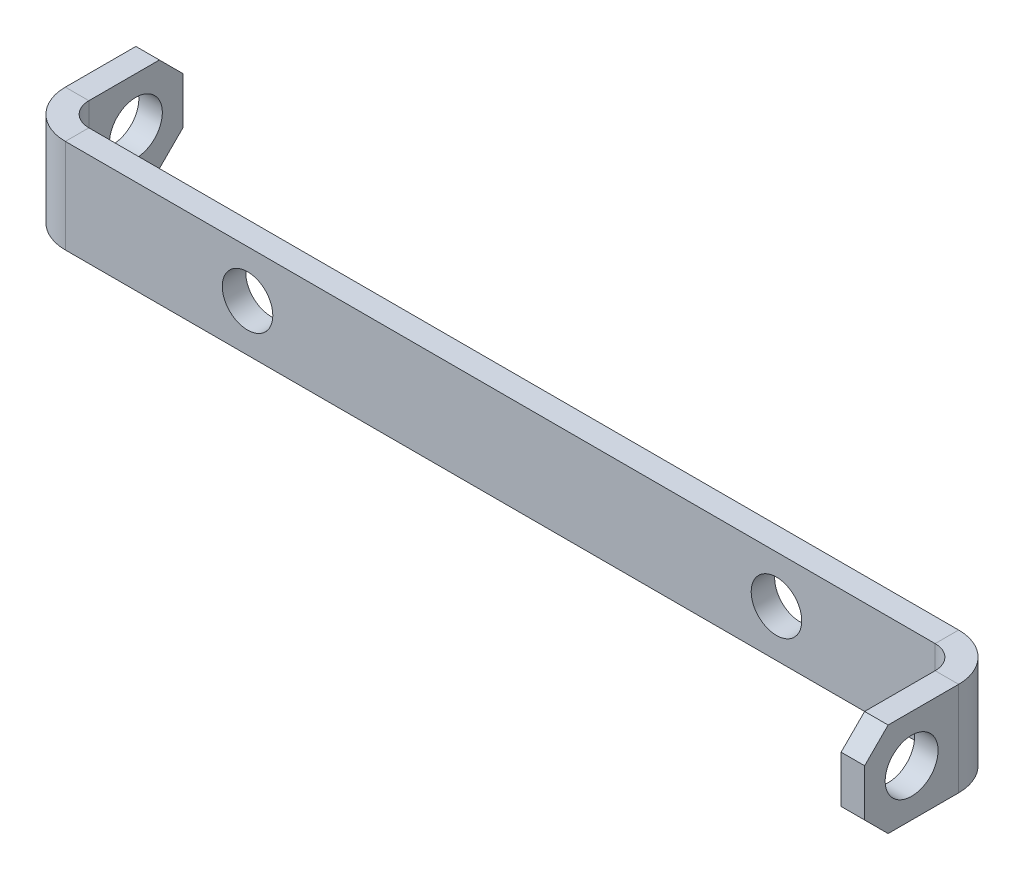
ISO-10303-21;
HEADER;
FILE_DESCRIPTION(('STEP AP214'),'2;1');
FILE_NAME('part.step','',(''),(''),'','','');
FILE_SCHEMA(('AUTOMOTIVE_DESIGN { 1 0 10303 214 1 1 1 1 }'));
ENDSEC;
DATA;
#1=APPLICATION_CONTEXT('core data for automotive mechanical design processes');
#2=APPLICATION_PROTOCOL_DEFINITION('international standard','automotive_design',2000,#1);
#3=PRODUCT_CONTEXT('',#1,'mechanical');
#4=PRODUCT('Part','Part','',(#3));
#5=PRODUCT_RELATED_PRODUCT_CATEGORY('part','',(#4));
#6=PRODUCT_DEFINITION_FORMATION('','',#4);
#7=PRODUCT_DEFINITION_CONTEXT('part definition',#1,'design');
#8=PRODUCT_DEFINITION('design','',#6,#7);
#9=PRODUCT_DEFINITION_SHAPE('','',#8);
#10=(LENGTH_UNIT() NAMED_UNIT(*) SI_UNIT(.MILLI.,.METRE.));
#11=(NAMED_UNIT(*) PLANE_ANGLE_UNIT() SI_UNIT($,.RADIAN.));
#12=(NAMED_UNIT(*) SI_UNIT($,.STERADIAN.) SOLID_ANGLE_UNIT());
#13=UNCERTAINTY_MEASURE_WITH_UNIT(LENGTH_MEASURE(1.E-05),#10,'distance_accuracy_value','');
#14=(GEOMETRIC_REPRESENTATION_CONTEXT(3) GLOBAL_UNCERTAINTY_ASSIGNED_CONTEXT((#13)) GLOBAL_UNIT_ASSIGNED_CONTEXT((#10,
#11,#12)) REPRESENTATION_CONTEXT('',''));
#15=CARTESIAN_POINT('',(0.,0.,0.));
#16=DIRECTION('',(0.,0.,1.));
#17=DIRECTION('',(1.,0.,0.));
#18=AXIS2_PLACEMENT_3D('',#15,#16,#17);
#19=CARTESIAN_POINT('',(-38.,8.,0.));
#20=DIRECTION('',(0.,1.,0.));
#21=DIRECTION('',(0.,0.,1.));
#22=AXIS2_PLACEMENT_3D('',#19,#20,#21);
#23=PLANE('',#22);
#24=DIRECTION('',(0.,0.,1.));
#25=VECTOR('',#24,1.);
#26=CARTESIAN_POINT('',(-38.,8.,0.));
#27=LINE('',#26,#25);
#28=CARTESIAN_POINT('',(-38.,8.,0.));
#29=VERTEX_POINT('',#28);
#30=CARTESIAN_POINT('',(-38.,8.,2.));
#31=VERTEX_POINT('',#30);
#32=EDGE_CURVE('E169',#29,#31,#27,.T.);
#33=ORIENTED_EDGE('',*,*,#32,.F.);
#34=CARTESIAN_POINT('',(-38.,8.,-2.));
#35=DIRECTION('',(0.,-1.,0.));
#36=DIRECTION('',(0.,0.,-1.));
#37=AXIS2_PLACEMENT_3D('',#34,#35,#36);
#38=CIRCLE('',#37,2.);
#39=CARTESIAN_POINT('',(-40.,8.,-2.));
#40=VERTEX_POINT('',#39);
#41=EDGE_CURVE('E167',#29,#40,#38,.T.);
#42=ORIENTED_EDGE('',*,*,#41,.T.);
#43=DIRECTION('',(1.,0.,0.));
#44=VECTOR('',#43,1.);
#45=CARTESIAN_POINT('',(-42.,8.,-2.));
#46=LINE('',#45,#44);
#47=CARTESIAN_POINT('',(-42.,8.,-2.));
#48=VERTEX_POINT('',#47);
#49=EDGE_CURVE('E161',#48,#40,#46,.T.);
#50=ORIENTED_EDGE('',*,*,#49,.F.);
#51=CARTESIAN_POINT('',(-38.,8.,-2.));
#52=DIRECTION('',(0.,1.,0.));
#53=DIRECTION('',(1.,0.,0.));
#54=AXIS2_PLACEMENT_3D('',#51,#52,#53);
#55=CIRCLE('',#54,4.);
#56=EDGE_CURVE('E164',#31,#48,#55,.F.);
#57=ORIENTED_EDGE('',*,*,#56,.F.);
#58=EDGE_LOOP('',(#33,#42,#50,#57));
#59=FACE_BOUND('',#58,.T.);
#60=ADVANCED_FACE('F44',(#59),#23,.T.);
#61=CARTESIAN_POINT('',(-42.,8.,-2.));
#62=DIRECTION('',(0.,1.,0.));
#63=DIRECTION('',(0.,0.,1.));
#64=AXIS2_PLACEMENT_3D('',#61,#62,#63);
#65=PLANE('',#64);
#66=DIRECTION('',(-1.,0.,0.));
#67=VECTOR('',#66,1.);
#68=CARTESIAN_POINT('',(-40.,8.,0.));
#69=LINE('',#68,#67);
#70=CARTESIAN_POINT('',(36.,8.,0.));
#71=VERTEX_POINT('',#70);
#72=EDGE_CURVE('E205',#71,#29,#69,.T.);
#73=ORIENTED_EDGE('',*,*,#72,.T.);
#74=ORIENTED_EDGE('',*,*,#32,.T.);
#75=DIRECTION('',(-1.,0.,0.));
#76=VECTOR('',#75,1.);
#77=CARTESIAN_POINT('',(-40.,8.,2.));
#78=LINE('',#77,#76);
#79=CARTESIAN_POINT('',(36.,8.,1.99999999999999));
#80=VERTEX_POINT('',#79);
#81=EDGE_CURVE('E190',#80,#31,#78,.T.);
#82=ORIENTED_EDGE('',*,*,#81,.F.);
#83=DIRECTION('',(0.,0.,-1.));
#84=VECTOR('',#83,1.);
#85=CARTESIAN_POINT('',(36.,8.,1.99999999999999));
#86=LINE('',#85,#84);
#87=EDGE_CURVE('E269',#80,#71,#86,.T.);
#88=ORIENTED_EDGE('',*,*,#87,.T.);
#89=EDGE_LOOP('',(#73,#74,#82,#88));
#90=FACE_BOUND('',#89,.T.);
#91=ADVANCED_FACE('F417',(#90),#65,.T.);
#92=CARTESIAN_POINT('',(-40.,0.,-2.));
#93=DIRECTION('',(0.,-1.,0.));
#94=DIRECTION('',(0.,0.,-1.));
#95=AXIS2_PLACEMENT_3D('',#92,#93,#94);
#96=PLANE('',#95);
#97=DIRECTION('',(-1.,0.,0.));
#98=VECTOR('',#97,1.);
#99=CARTESIAN_POINT('',(-40.,0.,-2.));
#100=LINE('',#99,#98);
#101=CARTESIAN_POINT('',(-40.,0.,-2.));
#102=VERTEX_POINT('',#101);
#103=CARTESIAN_POINT('',(-42.,0.,-2.));
#104=VERTEX_POINT('',#103);
#105=EDGE_CURVE('E170',#102,#104,#100,.T.);
#106=ORIENTED_EDGE('',*,*,#105,.F.);
#107=CARTESIAN_POINT('',(-38.,0.,-2.));
#108=DIRECTION('',(0.,-1.,0.));
#109=DIRECTION('',(0.,0.,-1.));
#110=AXIS2_PLACEMENT_3D('',#107,#108,#109);
#111=CIRCLE('',#110,2.);
#112=CARTESIAN_POINT('',(-38.,0.,0.));
#113=VERTEX_POINT('',#112);
#114=EDGE_CURVE('E233',#113,#102,#111,.T.);
#115=ORIENTED_EDGE('',*,*,#114,.F.);
#116=DIRECTION('',(0.,0.,-1.));
#117=VECTOR('',#116,1.);
#118=CARTESIAN_POINT('',(-38.,0.,2.));
#119=LINE('',#118,#117);
#120=CARTESIAN_POINT('',(-38.,0.,2.));
#121=VERTEX_POINT('',#120);
#122=EDGE_CURVE('E274',#121,#113,#119,.T.);
#123=ORIENTED_EDGE('',*,*,#122,.F.);
#124=CARTESIAN_POINT('',(-38.,0.,-2.));
#125=DIRECTION('',(0.,1.,0.));
#126=DIRECTION('',(1.,0.,0.));
#127=AXIS2_PLACEMENT_3D('',#124,#125,#126);
#128=CIRCLE('',#127,4.);
#129=EDGE_CURVE('E215',#121,#104,#128,.F.);
#130=ORIENTED_EDGE('',*,*,#129,.T.);
#131=EDGE_LOOP('',(#106,#115,#123,#130));
#132=FACE_BOUND('',#131,.T.);
#133=ADVANCED_FACE('F395',(#132),#96,.T.);
#134=CARTESIAN_POINT('',(-38.,0.,2.));
#135=DIRECTION('',(0.,-1.,0.));
#136=DIRECTION('',(0.,0.,-1.));
#137=AXIS2_PLACEMENT_3D('',#134,#135,#136);
#138=PLANE('',#137);
#139=DIRECTION('',(0.,0.,-1.));
#140=VECTOR('',#139,1.);
#141=CARTESIAN_POINT('',(-42.,0.,-10.));
#142=LINE('',#141,#140);
#143=CARTESIAN_POINT('',(-42.,0.,-8.00000000000001));
#144=VERTEX_POINT('',#143);
#145=EDGE_CURVE('E177',#104,#144,#142,.T.);
#146=ORIENTED_EDGE('',*,*,#145,.T.);
#147=DIRECTION('',(1.,0.,0.));
#148=VECTOR('',#147,1.);
#149=CARTESIAN_POINT('',(-38.,0.,-8.00000000000001));
#150=LINE('',#149,#148);
#151=CARTESIAN_POINT('',(-40.,0.,-8.00000000000001));
#152=VERTEX_POINT('',#151);
#153=EDGE_CURVE('E11',#144,#152,#150,.T.);
#154=ORIENTED_EDGE('',*,*,#153,.T.);
#155=DIRECTION('',(0.,0.,-1.));
#156=VECTOR('',#155,1.);
#157=CARTESIAN_POINT('',(-40.,0.,-10.));
#158=LINE('',#157,#156);
#159=EDGE_CURVE('E210',#102,#152,#158,.T.);
#160=ORIENTED_EDGE('',*,*,#159,.F.);
#161=ORIENTED_EDGE('',*,*,#105,.T.);
#162=EDGE_LOOP('',(#146,#154,#160,#161));
#163=FACE_BOUND('',#162,.T.);
#164=ADVANCED_FACE('F405',(#163),#138,.T.);
#165=CARTESIAN_POINT('',(40.,8.,3.99999999999999));
#166=DIRECTION('',(0.,1.,0.));
#167=DIRECTION('',(0.,0.,1.));
#168=AXIS2_PLACEMENT_3D('',#165,#166,#167);
#169=PLANE('',#168);
#170=DIRECTION('',(-1.,0.,0.));
#171=VECTOR('',#170,1.);
#172=CARTESIAN_POINT('',(40.,8.,3.99999999999999));
#173=LINE('',#172,#171);
#174=CARTESIAN_POINT('',(40.,8.,3.99999999999999));
#175=VERTEX_POINT('',#174);
#176=CARTESIAN_POINT('',(38.,8.,3.99999999999999));
#177=VERTEX_POINT('',#176);
#178=EDGE_CURVE('E271',#175,#177,#173,.T.);
#179=ORIENTED_EDGE('',*,*,#178,.F.);
#180=CARTESIAN_POINT('',(36.,8.,3.99999999999999));
#181=DIRECTION('',(0.,1.,0.));
#182=DIRECTION('',(0.,0.,1.));
#183=AXIS2_PLACEMENT_3D('',#180,#181,#182);
#184=CIRCLE('',#183,4.);
#185=EDGE_CURVE('E202',#175,#71,#184,.T.);
#186=ORIENTED_EDGE('',*,*,#185,.T.);
#187=ORIENTED_EDGE('',*,*,#87,.F.);
#188=CARTESIAN_POINT('',(36.,8.,3.99999999999999));
#189=DIRECTION('',(0.,1.,0.));
#190=DIRECTION('',(1.,0.,0.));
#191=AXIS2_PLACEMENT_3D('',#188,#189,#190);
#192=CIRCLE('',#191,2.);
#193=EDGE_CURVE('E192',#177,#80,#192,.T.);
#194=ORIENTED_EDGE('',*,*,#193,.F.);
#195=EDGE_LOOP('',(#179,#186,#187,#194));
#196=FACE_BOUND('',#195,.T.);
#197=ADVANCED_FACE('F567',(#196),#169,.T.);
#198=CARTESIAN_POINT('',(36.,8.,1.99999999999999));
#199=DIRECTION('',(0.,1.,0.));
#200=DIRECTION('',(0.,0.,1.));
#201=AXIS2_PLACEMENT_3D('',#198,#199,#200);
#202=PLANE('',#201);
#203=DIRECTION('',(0.,0.,-1.));
#204=VECTOR('',#203,1.);
#205=CARTESIAN_POINT('',(38.,8.,12.));
#206=LINE('',#205,#204);
#207=CARTESIAN_POINT('',(38.,8.,9.99999999999999));
#208=VERTEX_POINT('',#207);
#209=EDGE_CURVE('E198',#208,#177,#206,.T.);
#210=ORIENTED_EDGE('',*,*,#209,.F.);
#211=DIRECTION('',(1.,0.,0.));
#212=VECTOR('',#211,1.);
#213=CARTESIAN_POINT('',(36.,8.,9.99999999999999));
#214=LINE('',#213,#212);
#215=CARTESIAN_POINT('',(40.,8.,9.99999999999999));
#216=VERTEX_POINT('',#215);
#217=EDGE_CURVE('E294',#208,#216,#214,.T.);
#218=ORIENTED_EDGE('',*,*,#217,.T.);
#219=DIRECTION('',(0.,0.,-1.));
#220=VECTOR('',#219,1.);
#221=CARTESIAN_POINT('',(40.,8.,12.));
#222=LINE('',#221,#220);
#223=EDGE_CURVE('E200',#216,#175,#222,.T.);
#224=ORIENTED_EDGE('',*,*,#223,.T.);
#225=ORIENTED_EDGE('',*,*,#178,.T.);
#226=EDGE_LOOP('',(#210,#218,#224,#225));
#227=FACE_BOUND('',#226,.T.);
#228=ADVANCED_FACE('F572',(#227),#202,.T.);
#229=CARTESIAN_POINT('',(36.,0.,0.));
#230=DIRECTION('',(0.,-1.,0.));
#231=DIRECTION('',(0.,0.,-1.));
#232=AXIS2_PLACEMENT_3D('',#229,#230,#231);
#233=PLANE('',#232);
#234=DIRECTION('',(0.,0.,1.));
#235=VECTOR('',#234,1.);
#236=CARTESIAN_POINT('',(36.,0.,0.));
#237=LINE('',#236,#235);
#238=CARTESIAN_POINT('',(36.,0.,0.));
#239=VERTEX_POINT('',#238);
#240=CARTESIAN_POINT('',(36.,0.,1.99999999999999));
#241=VERTEX_POINT('',#240);
#242=EDGE_CURVE('E267',#239,#241,#237,.T.);
#243=ORIENTED_EDGE('',*,*,#242,.F.);
#244=CARTESIAN_POINT('',(36.,0.,3.99999999999999));
#245=DIRECTION('',(0.,1.,0.));
#246=DIRECTION('',(0.,0.,1.));
#247=AXIS2_PLACEMENT_3D('',#244,#245,#246);
#248=CIRCLE('',#247,4.);
#249=CARTESIAN_POINT('',(40.,0.,3.99999999999999));
#250=VERTEX_POINT('',#249);
#251=EDGE_CURVE('E227',#250,#239,#248,.T.);
#252=ORIENTED_EDGE('',*,*,#251,.F.);
#253=DIRECTION('',(1.,0.,0.));
#254=VECTOR('',#253,1.);
#255=CARTESIAN_POINT('',(38.,0.,3.99999999999999));
#256=LINE('',#255,#254);
#257=CARTESIAN_POINT('',(38.,0.,3.99999999999999));
#258=VERTEX_POINT('',#257);
#259=EDGE_CURVE('E264',#258,#250,#256,.T.);
#260=ORIENTED_EDGE('',*,*,#259,.F.);
#261=CARTESIAN_POINT('',(36.,0.,3.99999999999999));
#262=DIRECTION('',(0.,1.,0.));
#263=DIRECTION('',(1.,0.,0.));
#264=AXIS2_PLACEMENT_3D('',#261,#262,#263);
#265=CIRCLE('',#264,2.);
#266=EDGE_CURVE('E220',#258,#241,#265,.T.);
#267=ORIENTED_EDGE('',*,*,#266,.T.);
#268=EDGE_LOOP('',(#243,#252,#260,#267));
#269=FACE_BOUND('',#268,.T.);
#270=ADVANCED_FACE('F380',(#269),#233,.T.);
#271=CARTESIAN_POINT('',(38.,0.,3.99999999999999));
#272=DIRECTION('',(0.,-1.,0.));
#273=DIRECTION('',(0.,0.,-1.));
#274=AXIS2_PLACEMENT_3D('',#271,#272,#273);
#275=PLANE('',#274);
#276=DIRECTION('',(-1.,0.,0.));
#277=VECTOR('',#276,1.);
#278=CARTESIAN_POINT('',(-40.,0.,0.));
#279=LINE('',#278,#277);
#280=EDGE_CURVE('E230',#239,#113,#279,.T.);
#281=ORIENTED_EDGE('',*,*,#280,.F.);
#282=ORIENTED_EDGE('',*,*,#242,.T.);
#283=DIRECTION('',(-1.,0.,0.));
#284=VECTOR('',#283,1.);
#285=CARTESIAN_POINT('',(-40.,0.,2.));
#286=LINE('',#285,#284);
#287=EDGE_CURVE('E217',#241,#121,#286,.T.);
#288=ORIENTED_EDGE('',*,*,#287,.T.);
#289=ORIENTED_EDGE('',*,*,#122,.T.);
#290=EDGE_LOOP('',(#281,#282,#288,#289));
#291=FACE_BOUND('',#290,.T.);
#292=ADVANCED_FACE('F384',(#291),#275,.T.);
#293=CARTESIAN_POINT('',(-40.,8.,-10.));
#294=DIRECTION('',(-1.,0.,0.));
#295=DIRECTION('',(0.,0.,1.));
#296=AXIS2_PLACEMENT_3D('',#293,#294,#295);
#297=PLANE('',#296);
#298=CARTESIAN_POINT('',(-40.,4.,-6.));
#299=DIRECTION('',(-1.,0.,0.));
#300=DIRECTION('',(0.,0.,1.));
#301=AXIS2_PLACEMENT_3D('',#298,#299,#300);
#302=CIRCLE('',#301,2.25);
#303=CARTESIAN_POINT('',(-40.,4.,-3.75));
#304=VERTEX_POINT('',#303);
#305=EDGE_CURVE('E329',#304,#304,#302,.T.);
#306=ORIENTED_EDGE('',*,*,#305,.T.);
#307=EDGE_LOOP('',(#306));
#308=FACE_BOUND('',#307,.T.);
#309=DIRECTION('',(0.,-1.,0.));
#310=VECTOR('',#309,1.);
#311=CARTESIAN_POINT('',(-40.,8.,-10.));
#312=LINE('',#311,#310);
#313=CARTESIAN_POINT('',(-40.,6.00000000000001,-10.));
#314=VERTEX_POINT('',#313);
#315=CARTESIAN_POINT('',(-40.,2.,-10.));
#316=VERTEX_POINT('',#315);
#317=EDGE_CURVE('E261',#314,#316,#312,.T.);
#318=ORIENTED_EDGE('',*,*,#317,.F.);
#319=DIRECTION('',(0.,-0.707106781186546,-0.707106781186549));
#320=VECTOR('',#319,1.);
#321=CARTESIAN_POINT('',(-40.,6.00000000000001,-10.));
#322=LINE('',#321,#320);
#323=CARTESIAN_POINT('',(-40.,8.,-8.));
#324=VERTEX_POINT('',#323);
#325=EDGE_CURVE('E310',#314,#324,#322,.F.);
#326=ORIENTED_EDGE('',*,*,#325,.T.);
#327=DIRECTION('',(0.,0.,-1.));
#328=VECTOR('',#327,1.);
#329=CARTESIAN_POINT('',(-40.,8.,-10.));
#330=LINE('',#329,#328);
#331=EDGE_CURVE('E185',#40,#324,#330,.T.);
#332=ORIENTED_EDGE('',*,*,#331,.F.);
#333=DIRECTION('',(0.,-1.,0.));
#334=VECTOR('',#333,1.);
#335=CARTESIAN_POINT('',(-40.,8.,-2.));
#336=LINE('',#335,#334);
#337=EDGE_CURVE('E209',#40,#102,#336,.T.);
#338=ORIENTED_EDGE('',*,*,#337,.T.);
#339=ORIENTED_EDGE('',*,*,#159,.T.);
#340=DIRECTION('',(0.,-0.707106781186549,0.707106781186546));
#341=VECTOR('',#340,1.);
#342=CARTESIAN_POINT('',(-40.,0.,-8.00000000000001));
#343=LINE('',#342,#341);
#344=EDGE_CURVE('E308',#152,#316,#343,.F.);
#345=ORIENTED_EDGE('',*,*,#344,.T.);
#346=EDGE_LOOP('',(#318,#326,#332,#338,#339,#345));
#347=FACE_BOUND('',#346,.T.);
#348=ADVANCED_FACE('F323',(#308,#347),#297,.F.);
#349=CARTESIAN_POINT('',(-42.,8.,-10.));
#350=DIRECTION('',(0.,0.,-1.));
#351=DIRECTION('',(-1.,0.,0.));
#352=AXIS2_PLACEMENT_3D('',#349,#350,#351);
#353=PLANE('',#352);
#354=DIRECTION('',(0.,-1.,0.));
#355=VECTOR('',#354,1.);
#356=CARTESIAN_POINT('',(-42.,8.,-10.));
#357=LINE('',#356,#355);
#358=CARTESIAN_POINT('',(-42.,6.00000000000001,-10.));
#359=VERTEX_POINT('',#358);
#360=CARTESIAN_POINT('',(-42.,2.,-10.));
#361=VERTEX_POINT('',#360);
#362=EDGE_CURVE('E181',#359,#361,#357,.T.);
#363=ORIENTED_EDGE('',*,*,#362,.F.);
#364=DIRECTION('',(1.,0.,0.));
#365=VECTOR('',#364,1.);
#366=CARTESIAN_POINT('',(-42.,6.00000000000001,-10.));
#367=LINE('',#366,#365);
#368=EDGE_CURVE('E305',#359,#314,#367,.T.);
#369=ORIENTED_EDGE('',*,*,#368,.T.);
#370=ORIENTED_EDGE('',*,*,#317,.T.);
#371=DIRECTION('',(-1.,0.,0.));
#372=VECTOR('',#371,1.);
#373=CARTESIAN_POINT('',(-42.,2.,-10.));
#374=LINE('',#373,#372);
#375=EDGE_CURVE('E303',#316,#361,#374,.T.);
#376=ORIENTED_EDGE('',*,*,#375,.T.);
#377=EDGE_LOOP('',(#363,#369,#370,#376));
#378=FACE_BOUND('',#377,.T.);
#379=ADVANCED_FACE('F317',(#378),#353,.T.);
#380=CARTESIAN_POINT('',(-42.,8.,-10.));
#381=DIRECTION('',(-1.,0.,0.));
#382=DIRECTION('',(0.,0.,1.));
#383=AXIS2_PLACEMENT_3D('',#380,#381,#382);
#384=PLANE('',#383);
#385=CARTESIAN_POINT('',(-42.,4.,-6.));
#386=DIRECTION('',(-1.,0.,0.));
#387=DIRECTION('',(0.,0.,1.));
#388=AXIS2_PLACEMENT_3D('',#385,#386,#387);
#389=CIRCLE('',#388,2.25);
#390=CARTESIAN_POINT('',(-42.,4.,-3.75));
#391=VERTEX_POINT('',#390);
#392=EDGE_CURVE('E332',#391,#391,#389,.T.);
#393=ORIENTED_EDGE('',*,*,#392,.F.);
#394=EDGE_LOOP('',(#393));
#395=FACE_BOUND('',#394,.T.);
#396=DIRECTION('',(0.,0.,-1.));
#397=VECTOR('',#396,1.);
#398=CARTESIAN_POINT('',(-42.,8.,-10.));
#399=LINE('',#398,#397);
#400=CARTESIAN_POINT('',(-42.,8.,-8.));
#401=VERTEX_POINT('',#400);
#402=EDGE_CURVE('E175',#48,#401,#399,.T.);
#403=ORIENTED_EDGE('',*,*,#402,.T.);
#404=DIRECTION('',(0.,0.707106781186546,0.707106781186549));
#405=VECTOR('',#404,1.);
#406=CARTESIAN_POINT('',(-42.,7.,-9.));
#407=LINE('',#406,#405);
#408=EDGE_CURVE('E52',#401,#359,#407,.F.);
#409=ORIENTED_EDGE('',*,*,#408,.T.);
#410=ORIENTED_EDGE('',*,*,#362,.T.);
#411=DIRECTION('',(0.,0.707106781186549,-0.707106781186546));
#412=VECTOR('',#411,1.);
#413=CARTESIAN_POINT('',(-42.,5.00000000000001,-13.));
#414=LINE('',#413,#412);
#415=EDGE_CURVE('E59',#361,#144,#414,.F.);
#416=ORIENTED_EDGE('',*,*,#415,.T.);
#417=ORIENTED_EDGE('',*,*,#145,.F.);
#418=DIRECTION('',(0.,-1.,0.));
#419=VECTOR('',#418,1.);
#420=CARTESIAN_POINT('',(-42.,8.,-2.));
#421=LINE('',#420,#419);
#422=EDGE_CURVE('E173',#48,#104,#421,.T.);
#423=ORIENTED_EDGE('',*,*,#422,.F.);
#424=EDGE_LOOP('',(#403,#409,#410,#416,#417,#423));
#425=FACE_BOUND('',#424,.T.);
#426=ADVANCED_FACE('F174',(#395,#425),#384,.T.);
#427=CARTESIAN_POINT('',(-38.,8.,-2.));
#428=DIRECTION('',(0.,-1.,0.));
#429=DIRECTION('',(0.,0.,-1.));
#430=AXIS2_PLACEMENT_3D('',#427,#428,#429);
#431=CYLINDRICAL_SURFACE('',#430,4.);
#432=ORIENTED_EDGE('',*,*,#129,.F.);
#433=DIRECTION('',(0.,-1.,0.));
#434=VECTOR('',#433,1.);
#435=CARTESIAN_POINT('',(-38.,8.,2.));
#436=LINE('',#435,#434);
#437=EDGE_CURVE('E182',#31,#121,#436,.T.);
#438=ORIENTED_EDGE('',*,*,#437,.F.);
#439=ORIENTED_EDGE('',*,*,#56,.T.);
#440=ORIENTED_EDGE('',*,*,#422,.T.);
#441=EDGE_LOOP('',(#432,#438,#439,#440));
#442=FACE_BOUND('',#441,.T.);
#443=ADVANCED_FACE('F188',(#442),#431,.T.);
#444=CARTESIAN_POINT('',(-40.,8.,2.));
#445=DIRECTION('',(0.,0.,1.));
#446=DIRECTION('',(1.,0.,0.));
#447=AXIS2_PLACEMENT_3D('',#444,#445,#446);
#448=PLANE('',#447);
#449=CARTESIAN_POINT('',(22.5,4.00000000000001,2.));
#450=DIRECTION('',(0.,0.,1.));
#451=DIRECTION('',(-1.,0.,0.));
#452=AXIS2_PLACEMENT_3D('',#449,#450,#451);
#453=CIRCLE('',#452,2.15);
#454=CARTESIAN_POINT('',(20.35,4.00000000000001,2.));
#455=VERTEX_POINT('',#454);
#456=EDGE_CURVE('E285',#455,#455,#453,.T.);
#457=ORIENTED_EDGE('',*,*,#456,.F.);
#458=EDGE_LOOP('',(#457));
#459=FACE_BOUND('',#458,.T.);
#460=CARTESIAN_POINT('',(-22.5,4.,2.));
#461=DIRECTION('',(0.,0.,1.));
#462=DIRECTION('',(1.,0.,0.));
#463=AXIS2_PLACEMENT_3D('',#460,#461,#462);
#464=CIRCLE('',#463,2.15);
#465=CARTESIAN_POINT('',(-20.35,4.,2.));
#466=VERTEX_POINT('',#465);
#467=EDGE_CURVE('E281',#466,#466,#464,.T.);
#468=ORIENTED_EDGE('',*,*,#467,.F.);
#469=EDGE_LOOP('',(#468));
#470=FACE_BOUND('',#469,.T.);
#471=ORIENTED_EDGE('',*,*,#287,.F.);
#472=DIRECTION('',(0.,-1.,0.));
#473=VECTOR('',#472,1.);
#474=CARTESIAN_POINT('',(36.,8.,1.99999999999999));
#475=LINE('',#474,#473);
#476=EDGE_CURVE('E256',#80,#241,#475,.T.);
#477=ORIENTED_EDGE('',*,*,#476,.F.);
#478=ORIENTED_EDGE('',*,*,#81,.T.);
#479=ORIENTED_EDGE('',*,*,#437,.T.);
#480=EDGE_LOOP('',(#471,#477,#478,#479));
#481=FACE_BOUND('',#480,.T.);
#482=ADVANCED_FACE('F393',(#459,#470,#481),#448,.T.);
#483=CARTESIAN_POINT('',(36.,8.,3.99999999999999));
#484=DIRECTION('',(0.,-1.,0.));
#485=DIRECTION('',(0.,0.,-1.));
#486=AXIS2_PLACEMENT_3D('',#483,#484,#485);
#487=CYLINDRICAL_SURFACE('',#486,2.);
#488=ORIENTED_EDGE('',*,*,#266,.F.);
#489=DIRECTION('',(0.,-1.,0.));
#490=VECTOR('',#489,1.);
#491=CARTESIAN_POINT('',(38.,8.,3.99999999999999));
#492=LINE('',#491,#490);
#493=EDGE_CURVE('E253',#177,#258,#492,.T.);
#494=ORIENTED_EDGE('',*,*,#493,.F.);
#495=ORIENTED_EDGE('',*,*,#193,.T.);
#496=ORIENTED_EDGE('',*,*,#476,.T.);
#497=EDGE_LOOP('',(#488,#494,#495,#496));
#498=FACE_BOUND('',#497,.T.);
#499=ADVANCED_FACE('F388',(#498),#487,.F.);
#500=CARTESIAN_POINT('',(38.,8.,12.));
#501=DIRECTION('',(-1.,0.,0.));
#502=DIRECTION('',(0.,0.,1.));
#503=AXIS2_PLACEMENT_3D('',#500,#501,#502);
#504=PLANE('',#503);
#505=CARTESIAN_POINT('',(38.,4.,7.99999999999999));
#506=DIRECTION('',(-1.,0.,0.));
#507=DIRECTION('',(0.,0.,1.));
#508=AXIS2_PLACEMENT_3D('',#505,#506,#507);
#509=CIRCLE('',#508,2.25);
#510=CARTESIAN_POINT('',(38.,4.,10.25));
#511=VERTEX_POINT('',#510);
#512=EDGE_CURVE('E335',#511,#511,#509,.T.);
#513=ORIENTED_EDGE('',*,*,#512,.F.);
#514=EDGE_LOOP('',(#513));
#515=FACE_BOUND('',#514,.T.);
#516=DIRECTION('',(0.,-1.,0.));
#517=VECTOR('',#516,1.);
#518=CARTESIAN_POINT('',(38.,8.,12.));
#519=LINE('',#518,#517);
#520=CARTESIAN_POINT('',(38.,6.00000000000001,12.));
#521=VERTEX_POINT('',#520);
#522=CARTESIAN_POINT('',(38.,2.,12.));
#523=VERTEX_POINT('',#522);
#524=EDGE_CURVE('E250',#521,#523,#519,.T.);
#525=ORIENTED_EDGE('',*,*,#524,.F.);
#526=DIRECTION('',(0.,-0.707106781186546,0.707106781186549));
#527=VECTOR('',#526,1.);
#528=CARTESIAN_POINT('',(38.,7.,11.));
#529=LINE('',#528,#527);
#530=EDGE_CURVE('E292',#521,#208,#529,.F.);
#531=ORIENTED_EDGE('',*,*,#530,.T.);
#532=ORIENTED_EDGE('',*,*,#209,.T.);
#533=ORIENTED_EDGE('',*,*,#493,.T.);
#534=DIRECTION('',(0.,0.,-1.));
#535=VECTOR('',#534,1.);
#536=CARTESIAN_POINT('',(38.,0.,12.));
#537=LINE('',#536,#535);
#538=CARTESIAN_POINT('',(38.,0.,9.99999999999999));
#539=VERTEX_POINT('',#538);
#540=EDGE_CURVE('E223',#539,#258,#537,.T.);
#541=ORIENTED_EDGE('',*,*,#540,.F.);
#542=DIRECTION('',(0.,0.707106781186549,0.707106781186546));
#543=VECTOR('',#542,1.);
#544=CARTESIAN_POINT('',(38.,5.00000000000001,15.));
#545=LINE('',#544,#543);
#546=EDGE_CURVE('E290',#539,#523,#545,.T.);
#547=ORIENTED_EDGE('',*,*,#546,.T.);
#548=EDGE_LOOP('',(#525,#531,#532,#533,#541,#547));
#549=FACE_BOUND('',#548,.T.);
#550=ADVANCED_FACE('F365',(#515,#549),#504,.T.);
#551=CARTESIAN_POINT('',(40.,8.,12.));
#552=DIRECTION('',(0.,0.,1.));
#553=DIRECTION('',(1.,0.,0.));
#554=AXIS2_PLACEMENT_3D('',#551,#552,#553);
#555=PLANE('',#554);
#556=DIRECTION('',(0.,-1.,0.));
#557=VECTOR('',#556,1.);
#558=CARTESIAN_POINT('',(40.,8.,12.));
#559=LINE('',#558,#557);
#560=CARTESIAN_POINT('',(40.,6.00000000000001,12.));
#561=VERTEX_POINT('',#560);
#562=CARTESIAN_POINT('',(40.,2.,12.));
#563=VERTEX_POINT('',#562);
#564=EDGE_CURVE('E247',#561,#563,#559,.T.);
#565=ORIENTED_EDGE('',*,*,#564,.F.);
#566=DIRECTION('',(-1.,0.,0.));
#567=VECTOR('',#566,1.);
#568=CARTESIAN_POINT('',(40.,6.00000000000001,12.));
#569=LINE('',#568,#567);
#570=EDGE_CURVE('E287',#561,#521,#569,.T.);
#571=ORIENTED_EDGE('',*,*,#570,.T.);
#572=ORIENTED_EDGE('',*,*,#524,.T.);
#573=DIRECTION('',(1.,0.,0.));
#574=VECTOR('',#573,1.);
#575=CARTESIAN_POINT('',(40.,2.,12.));
#576=LINE('',#575,#574);
#577=EDGE_CURVE('E278',#523,#563,#576,.T.);
#578=ORIENTED_EDGE('',*,*,#577,.T.);
#579=EDGE_LOOP('',(#565,#571,#572,#578));
#580=FACE_BOUND('',#579,.T.);
#581=ADVANCED_FACE('F348',(#580),#555,.T.);
#582=CARTESIAN_POINT('',(40.,8.,12.));
#583=DIRECTION('',(-1.,0.,0.));
#584=DIRECTION('',(0.,0.,1.));
#585=AXIS2_PLACEMENT_3D('',#582,#583,#584);
#586=PLANE('',#585);
#587=CARTESIAN_POINT('',(40.,4.,7.99999999999999));
#588=DIRECTION('',(1.,0.,0.));
#589=DIRECTION('',(0.,0.,-1.));
#590=AXIS2_PLACEMENT_3D('',#587,#588,#589);
#591=CIRCLE('',#590,2.25);
#592=CARTESIAN_POINT('',(40.,4.,5.74999999999999));
#593=VERTEX_POINT('',#592);
#594=EDGE_CURVE('E338',#593,#593,#591,.T.);
#595=ORIENTED_EDGE('',*,*,#594,.F.);
#596=EDGE_LOOP('',(#595));
#597=FACE_BOUND('',#596,.T.);
#598=ORIENTED_EDGE('',*,*,#223,.F.);
#599=DIRECTION('',(0.,0.707106781186546,-0.707106781186549));
#600=VECTOR('',#599,1.);
#601=CARTESIAN_POINT('',(40.,6.00000000000001,12.));
#602=LINE('',#601,#600);
#603=EDGE_CURVE('E298',#216,#561,#602,.F.);
#604=ORIENTED_EDGE('',*,*,#603,.T.);
#605=ORIENTED_EDGE('',*,*,#564,.T.);
#606=DIRECTION('',(0.,-0.707106781186549,-0.707106781186546));
#607=VECTOR('',#606,1.);
#608=CARTESIAN_POINT('',(40.,0.,9.99999999999999));
#609=LINE('',#608,#607);
#610=CARTESIAN_POINT('',(40.,0.,9.99999999999999));
#611=VERTEX_POINT('',#610);
#612=EDGE_CURVE('E296',#563,#611,#609,.T.);
#613=ORIENTED_EDGE('',*,*,#612,.T.);
#614=DIRECTION('',(0.,0.,-1.));
#615=VECTOR('',#614,1.);
#616=CARTESIAN_POINT('',(40.,0.,12.));
#617=LINE('',#616,#615);
#618=EDGE_CURVE('E225',#611,#250,#617,.T.);
#619=ORIENTED_EDGE('',*,*,#618,.T.);
#620=DIRECTION('',(0.,-1.,0.));
#621=VECTOR('',#620,1.);
#622=CARTESIAN_POINT('',(40.,8.,3.99999999999999));
#623=LINE('',#622,#621);
#624=EDGE_CURVE('E244',#175,#250,#623,.T.);
#625=ORIENTED_EDGE('',*,*,#624,.F.);
#626=EDGE_LOOP('',(#598,#604,#605,#613,#619,#625));
#627=FACE_BOUND('',#626,.T.);
#628=ADVANCED_FACE('F344',(#597,#627),#586,.F.);
#629=CARTESIAN_POINT('',(36.,8.,3.99999999999999));
#630=DIRECTION('',(0.,-1.,0.));
#631=DIRECTION('',(0.,0.,-1.));
#632=AXIS2_PLACEMENT_3D('',#629,#630,#631);
#633=CYLINDRICAL_SURFACE('',#632,4.);
#634=ORIENTED_EDGE('',*,*,#251,.T.);
#635=DIRECTION('',(0.,-1.,0.));
#636=VECTOR('',#635,1.);
#637=CARTESIAN_POINT('',(36.,8.,0.));
#638=LINE('',#637,#636);
#639=EDGE_CURVE('E241',#71,#239,#638,.T.);
#640=ORIENTED_EDGE('',*,*,#639,.F.);
#641=ORIENTED_EDGE('',*,*,#185,.F.);
#642=ORIENTED_EDGE('',*,*,#624,.T.);
#643=EDGE_LOOP('',(#634,#640,#641,#642));
#644=FACE_BOUND('',#643,.T.);
#645=ADVANCED_FACE('F347',(#644),#633,.T.);
#646=CARTESIAN_POINT('',(-40.,8.,0.));
#647=DIRECTION('',(0.,0.,1.));
#648=DIRECTION('',(1.,0.,0.));
#649=AXIS2_PLACEMENT_3D('',#646,#647,#648);
#650=PLANE('',#649);
#651=CARTESIAN_POINT('',(22.5,4.00000000000001,0.));
#652=DIRECTION('',(0.,0.,1.));
#653=DIRECTION('',(1.,0.,0.));
#654=AXIS2_PLACEMENT_3D('',#651,#652,#653);
#655=CIRCLE('',#654,2.15);
#656=CARTESIAN_POINT('',(24.65,4.00000000000001,0.));
#657=VERTEX_POINT('',#656);
#658=EDGE_CURVE('E282',#657,#657,#655,.T.);
#659=ORIENTED_EDGE('',*,*,#658,.T.);
#660=EDGE_LOOP('',(#659));
#661=FACE_BOUND('',#660,.T.);
#662=CARTESIAN_POINT('',(-22.5,4.,0.));
#663=DIRECTION('',(0.,0.,1.));
#664=DIRECTION('',(1.,0.,0.));
#665=AXIS2_PLACEMENT_3D('',#662,#663,#664);
#666=CIRCLE('',#665,2.15);
#667=CARTESIAN_POINT('',(-20.35,4.,0.));
#668=VERTEX_POINT('',#667);
#669=EDGE_CURVE('E213',#668,#668,#666,.T.);
#670=ORIENTED_EDGE('',*,*,#669,.T.);
#671=EDGE_LOOP('',(#670));
#672=FACE_BOUND('',#671,.T.);
#673=ORIENTED_EDGE('',*,*,#280,.T.);
#674=DIRECTION('',(0.,-1.,0.));
#675=VECTOR('',#674,1.);
#676=CARTESIAN_POINT('',(-38.,8.,0.));
#677=LINE('',#676,#675);
#678=EDGE_CURVE('E238',#29,#113,#677,.T.);
#679=ORIENTED_EDGE('',*,*,#678,.F.);
#680=ORIENTED_EDGE('',*,*,#72,.F.);
#681=ORIENTED_EDGE('',*,*,#639,.T.);
#682=EDGE_LOOP('',(#673,#679,#680,#681));
#683=FACE_BOUND('',#682,.T.);
#684=ADVANCED_FACE('F399',(#661,#672,#683),#650,.F.);
#685=CARTESIAN_POINT('',(-38.,8.,-2.));
#686=DIRECTION('',(0.,-1.,0.));
#687=DIRECTION('',(0.,0.,-1.));
#688=AXIS2_PLACEMENT_3D('',#685,#686,#687);
#689=CYLINDRICAL_SURFACE('',#688,2.);
#690=ORIENTED_EDGE('',*,*,#114,.T.);
#691=ORIENTED_EDGE('',*,*,#337,.F.);
#692=ORIENTED_EDGE('',*,*,#41,.F.);
#693=ORIENTED_EDGE('',*,*,#678,.T.);
#694=EDGE_LOOP('',(#690,#691,#692,#693));
#695=FACE_BOUND('',#694,.T.);
#696=ADVANCED_FACE('F402',(#695),#689,.F.);
#697=CARTESIAN_POINT('',(-38.,8.,-2.));
#698=DIRECTION('',(0.,1.,0.));
#699=DIRECTION('',(1.,0.,0.));
#700=AXIS2_PLACEMENT_3D('',#697,#698,#699);
#701=PLANE('',#700);
#702=ORIENTED_EDGE('',*,*,#331,.T.);
#703=DIRECTION('',(-1.,0.,0.));
#704=VECTOR('',#703,1.);
#705=CARTESIAN_POINT('',(-38.,8.,-8.));
#706=LINE('',#705,#704);
#707=EDGE_CURVE('E67',#324,#401,#706,.T.);
#708=ORIENTED_EDGE('',*,*,#707,.T.);
#709=ORIENTED_EDGE('',*,*,#402,.F.);
#710=ORIENTED_EDGE('',*,*,#49,.T.);
#711=EDGE_LOOP('',(#702,#708,#709,#710));
#712=FACE_BOUND('',#711,.T.);
#713=ADVANCED_FACE('F184',(#712),#701,.T.);
#714=CARTESIAN_POINT('',(-38.,0.,-2.));
#715=DIRECTION('',(0.,1.,0.));
#716=DIRECTION('',(1.,0.,0.));
#717=AXIS2_PLACEMENT_3D('',#714,#715,#716);
#718=PLANE('',#717);
#719=ORIENTED_EDGE('',*,*,#618,.F.);
#720=DIRECTION('',(-1.,0.,0.));
#721=VECTOR('',#720,1.);
#722=CARTESIAN_POINT('',(38.,0.,9.99999999999999));
#723=LINE('',#722,#721);
#724=EDGE_CURVE('E300',#611,#539,#723,.T.);
#725=ORIENTED_EDGE('',*,*,#724,.T.);
#726=ORIENTED_EDGE('',*,*,#540,.T.);
#727=ORIENTED_EDGE('',*,*,#259,.T.);
#728=EDGE_LOOP('',(#719,#725,#726,#727));
#729=FACE_BOUND('',#728,.T.);
#730=ADVANCED_FACE('F374',(#729),#718,.F.);
#731=CARTESIAN_POINT('',(-22.5,4.,-10.));
#732=DIRECTION('',(0.,0.,1.));
#733=DIRECTION('',(1.,0.,0.));
#734=AXIS2_PLACEMENT_3D('',#731,#732,#733);
#735=CYLINDRICAL_SURFACE('',#734,2.15);
#736=ORIENTED_EDGE('',*,*,#467,.T.);
#737=EDGE_LOOP('',(#736));
#738=FACE_BOUND('',#737,.T.);
#739=ORIENTED_EDGE('',*,*,#669,.F.);
#740=EDGE_LOOP('',(#739));
#741=FACE_BOUND('',#740,.T.);
#742=ADVANCED_FACE('F519',(#738,#741),#735,.F.);
#743=CARTESIAN_POINT('',(22.5,4.00000000000001,-10.));
#744=DIRECTION('',(0.,0.,1.));
#745=DIRECTION('',(1.,0.,0.));
#746=AXIS2_PLACEMENT_3D('',#743,#744,#745);
#747=CYLINDRICAL_SURFACE('',#746,2.15);
#748=ORIENTED_EDGE('',*,*,#456,.T.);
#749=EDGE_LOOP('',(#748));
#750=FACE_BOUND('',#749,.T.);
#751=ORIENTED_EDGE('',*,*,#658,.F.);
#752=EDGE_LOOP('',(#751));
#753=FACE_BOUND('',#752,.T.);
#754=ADVANCED_FACE('F428',(#750,#753),#747,.F.);
#755=CARTESIAN_POINT('',(40.,6.00000000000001,12.));
#756=DIRECTION('',(0.,-0.707106781186549,-0.707106781186546));
#757=DIRECTION('',(-1.,0.,0.));
#758=AXIS2_PLACEMENT_3D('',#755,#756,#757);
#759=PLANE('',#758);
#760=ORIENTED_EDGE('',*,*,#603,.F.);
#761=ORIENTED_EDGE('',*,*,#217,.F.);
#762=ORIENTED_EDGE('',*,*,#530,.F.);
#763=ORIENTED_EDGE('',*,*,#570,.F.);
#764=EDGE_LOOP('',(#760,#761,#762,#763));
#765=FACE_BOUND('',#764,.T.);
#766=ADVANCED_FACE('F360',(#765),#759,.F.);
#767=CARTESIAN_POINT('',(-38.,0.,9.99999999999999));
#768=DIRECTION('',(0.,-0.707106781186546,0.707106781186549));
#769=DIRECTION('',(1.,0.,0.));
#770=AXIS2_PLACEMENT_3D('',#767,#768,#769);
#771=PLANE('',#770);
#772=ORIENTED_EDGE('',*,*,#612,.F.);
#773=ORIENTED_EDGE('',*,*,#577,.F.);
#774=ORIENTED_EDGE('',*,*,#546,.F.);
#775=ORIENTED_EDGE('',*,*,#724,.F.);
#776=EDGE_LOOP('',(#772,#773,#774,#775));
#777=FACE_BOUND('',#776,.T.);
#778=ADVANCED_FACE('F371',(#777),#771,.T.);
#779=CARTESIAN_POINT('',(-42.,6.00000000000001,-10.));
#780=DIRECTION('',(0.,-0.707106781186549,0.707106781186546));
#781=DIRECTION('',(1.,0.,0.));
#782=AXIS2_PLACEMENT_3D('',#779,#780,#781);
#783=PLANE('',#782);
#784=ORIENTED_EDGE('',*,*,#408,.F.);
#785=ORIENTED_EDGE('',*,*,#707,.F.);
#786=ORIENTED_EDGE('',*,*,#325,.F.);
#787=ORIENTED_EDGE('',*,*,#368,.F.);
#788=EDGE_LOOP('',(#784,#785,#786,#787));
#789=FACE_BOUND('',#788,.T.);
#790=ADVANCED_FACE('F320',(#789),#783,.F.);
#791=CARTESIAN_POINT('',(-38.,0.,-8.00000000000001));
#792=DIRECTION('',(0.,0.707106781186546,0.707106781186549));
#793=DIRECTION('',(1.,0.,0.));
#794=AXIS2_PLACEMENT_3D('',#791,#792,#793);
#795=PLANE('',#794);
#796=ORIENTED_EDGE('',*,*,#415,.F.);
#797=ORIENTED_EDGE('',*,*,#375,.F.);
#798=ORIENTED_EDGE('',*,*,#344,.F.);
#799=ORIENTED_EDGE('',*,*,#153,.F.);
#800=EDGE_LOOP('',(#796,#797,#798,#799));
#801=FACE_BOUND('',#800,.T.);
#802=ADVANCED_FACE('F46',(#801),#795,.F.);
#803=CARTESIAN_POINT('',(40.,4.,-6.));
#804=DIRECTION('',(-1.,0.,0.));
#805=DIRECTION('',(0.,0.,1.));
#806=AXIS2_PLACEMENT_3D('',#803,#804,#805);
#807=CYLINDRICAL_SURFACE('',#806,2.25);
#808=ORIENTED_EDGE('',*,*,#392,.T.);
#809=EDGE_LOOP('',(#808));
#810=FACE_BOUND('',#809,.T.);
#811=ORIENTED_EDGE('',*,*,#305,.F.);
#812=EDGE_LOOP('',(#811));
#813=FACE_BOUND('',#812,.T.);
#814=ADVANCED_FACE('F409',(#810,#813),#807,.F.);
#815=CARTESIAN_POINT('',(-42.,4.,7.99999999999999));
#816=DIRECTION('',(1.,0.,0.));
#817=DIRECTION('',(0.,0.,-1.));
#818=AXIS2_PLACEMENT_3D('',#815,#816,#817);
#819=CYLINDRICAL_SURFACE('',#818,2.25);
#820=ORIENTED_EDGE('',*,*,#512,.T.);
#821=EDGE_LOOP('',(#820));
#822=FACE_BOUND('',#821,.T.);
#823=ORIENTED_EDGE('',*,*,#594,.T.);
#824=EDGE_LOOP('',(#823));
#825=FACE_BOUND('',#824,.T.);
#826=ADVANCED_FACE('F342',(#822,#825),#819,.F.);
#827=CLOSED_SHELL('',(#60,#91,#133,#164,#197,#228,#270,#292,#348,#379,#426,#443,#482,#499,#550,
#581,#628,#645,#684,#696,#713,#730,#742,#754,#766,#778,#790,#802,#814,#826));
#828=MANIFOLD_SOLID_BREP('B2',#827);
#829=ADVANCED_BREP_SHAPE_REPRESENTATION('',(#18,#828),#14);
#830=SHAPE_DEFINITION_REPRESENTATION(#9,#829);
ENDSEC;
END-ISO-10303-21;
